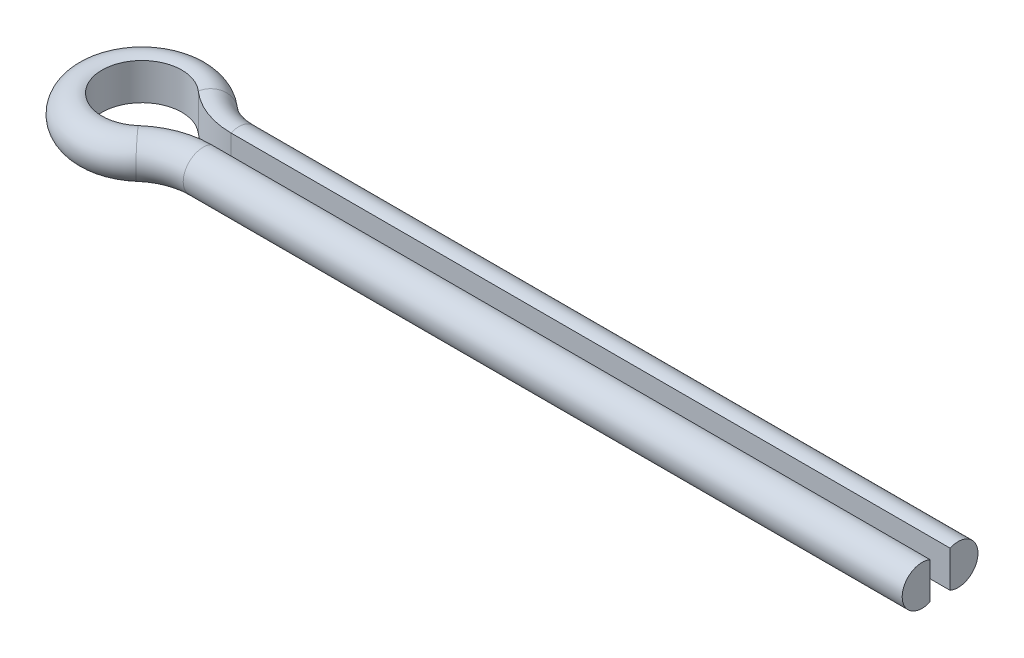
ISO-10303-21;
HEADER;
FILE_DESCRIPTION(('STEP AP214'),'2;1');
FILE_NAME('part.step','',(''),(''),'','','');
FILE_SCHEMA(('AUTOMOTIVE_DESIGN { 1 0 10303 214 1 1 1 1 }'));
ENDSEC;
DATA;
#1=APPLICATION_CONTEXT('core data for automotive mechanical design processes');
#2=APPLICATION_PROTOCOL_DEFINITION('international standard','automotive_design',2000,#1);
#3=PRODUCT_CONTEXT('',#1,'mechanical');
#4=PRODUCT('Part','Part','',(#3));
#5=PRODUCT_RELATED_PRODUCT_CATEGORY('part','',(#4));
#6=PRODUCT_DEFINITION_FORMATION('','',#4);
#7=PRODUCT_DEFINITION_CONTEXT('part definition',#1,'design');
#8=PRODUCT_DEFINITION('design','',#6,#7);
#9=PRODUCT_DEFINITION_SHAPE('','',#8);
#10=(LENGTH_UNIT() NAMED_UNIT(*) SI_UNIT(.MILLI.,.METRE.));
#11=(NAMED_UNIT(*) PLANE_ANGLE_UNIT() SI_UNIT($,.RADIAN.));
#12=(NAMED_UNIT(*) SI_UNIT($,.STERADIAN.) SOLID_ANGLE_UNIT());
#13=UNCERTAINTY_MEASURE_WITH_UNIT(LENGTH_MEASURE(1.E-05),#10,'distance_accuracy_value','');
#14=(GEOMETRIC_REPRESENTATION_CONTEXT(3) GLOBAL_UNCERTAINTY_ASSIGNED_CONTEXT((#13)) GLOBAL_UNIT_ASSIGNED_CONTEXT((#10,
#11,#12)) REPRESENTATION_CONTEXT('',''));
#15=CARTESIAN_POINT('',(0.,0.,0.));
#16=DIRECTION('',(0.,0.,1.));
#17=DIRECTION('',(1.,0.,0.));
#18=AXIS2_PLACEMENT_3D('',#15,#16,#17);
#19=CARTESIAN_POINT('',(0.,0.,1.));
#20=DIRECTION('',(-1.,0.,0.));
#21=DIRECTION('',(0.,0.,1.));
#22=AXIS2_PLACEMENT_3D('',#19,#20,#21);
#23=PLANE('',#22);
#24=CARTESIAN_POINT('',(0.,0.,1.));
#25=DIRECTION('',(1.,0.,0.));
#26=DIRECTION('',(0.,0.,1.));
#27=AXIS2_PLACEMENT_3D('',#24,#25,#26);
#28=CIRCLE('',#27,2.5);
#29=CARTESIAN_POINT('',(0.,2.29128784747792,0.));
#30=VERTEX_POINT('',#29);
#31=CARTESIAN_POINT('',(0.,-2.29128784747792,0.));
#32=VERTEX_POINT('',#31);
#33=EDGE_CURVE('E97',#30,#32,#28,.T.);
#34=ORIENTED_EDGE('',*,*,#33,.T.);
#35=DIRECTION('',(0.,1.,0.));
#36=VECTOR('',#35,1.);
#37=CARTESIAN_POINT('',(0.,-2.29128784747792,0.));
#38=LINE('',#37,#36);
#39=EDGE_CURVE('E107',#32,#30,#38,.T.);
#40=ORIENTED_EDGE('',*,*,#39,.T.);
#41=EDGE_LOOP('',(#34,#40));
#42=FACE_BOUND('',#41,.T.);
#43=ADVANCED_FACE('F45',(#42),#23,.F.);
#44=CARTESIAN_POINT('',(0.,0.,-3.49999999999999));
#45=DIRECTION('',(1.,0.,0.));
#46=DIRECTION('',(0.,0.,-1.));
#47=AXIS2_PLACEMENT_3D('',#44,#45,#46);
#48=PLANE('',#47);
#49=CARTESIAN_POINT('',(0.,0.,-3.49999999999999));
#50=DIRECTION('',(-1.,0.,0.));
#51=DIRECTION('',(0.,0.,-1.));
#52=AXIS2_PLACEMENT_3D('',#49,#50,#51);
#53=CIRCLE('',#52,2.5);
#54=CARTESIAN_POINT('',(0.,2.29128784747792,-2.49999999999999));
#55=VERTEX_POINT('',#54);
#56=CARTESIAN_POINT('',(0.,-2.29128784747792,-2.49999999999999));
#57=VERTEX_POINT('',#56);
#58=EDGE_CURVE('E60',#55,#57,#53,.T.);
#59=ORIENTED_EDGE('',*,*,#58,.F.);
#60=DIRECTION('',(0.,1.,0.));
#61=VECTOR('',#60,1.);
#62=CARTESIAN_POINT('',(0.,-2.29128784747792,-2.49999999999999));
#63=LINE('',#62,#61);
#64=EDGE_CURVE('E11',#57,#55,#63,.T.);
#65=ORIENTED_EDGE('',*,*,#64,.F.);
#66=EDGE_LOOP('',(#59,#65));
#67=FACE_BOUND('',#66,.T.);
#68=ADVANCED_FACE('F217',(#67),#48,.T.);
#69=CARTESIAN_POINT('',(0.,0.,1.));
#70=DIRECTION('',(-1.,0.,0.));
#71=DIRECTION('',(0.,0.,1.));
#72=AXIS2_PLACEMENT_3D('',#69,#70,#71);
#73=CYLINDRICAL_SURFACE('',#72,2.5);
#74=DIRECTION('',(-1.,0.,0.));
#75=VECTOR('',#74,1.);
#76=CARTESIAN_POINT('',(0.,-2.29128784747792,0.));
#77=LINE('',#76,#75);
#78=CARTESIAN_POINT('',(-90.0784325835078,-2.29128784747792,0.));
#79=VERTEX_POINT('',#78);
#80=EDGE_CURVE('E104',#32,#79,#77,.T.);
#81=ORIENTED_EDGE('',*,*,#80,.F.);
#82=ORIENTED_EDGE('',*,*,#33,.F.);
#83=DIRECTION('',(-1.,0.,0.));
#84=VECTOR('',#83,1.);
#85=CARTESIAN_POINT('',(0.,2.29128784747792,0.));
#86=LINE('',#85,#84);
#87=CARTESIAN_POINT('',(-90.0784325835078,2.29128784747792,0.));
#88=VERTEX_POINT('',#87);
#89=EDGE_CURVE('E102',#30,#88,#86,.T.);
#90=ORIENTED_EDGE('',*,*,#89,.T.);
#91=CARTESIAN_POINT('',(-90.0784325835078,0.,1.00000000000001));
#92=DIRECTION('',(1.,0.,0.));
#93=DIRECTION('',(0.,0.,1.));
#94=AXIS2_PLACEMENT_3D('',#91,#92,#93);
#95=CIRCLE('',#94,2.5);
#96=EDGE_CURVE('E118',#88,#79,#95,.T.);
#97=ORIENTED_EDGE('',*,*,#96,.T.);
#98=EDGE_LOOP('',(#81,#82,#90,#97));
#99=FACE_BOUND('',#98,.T.);
#100=ADVANCED_FACE('F99',(#99),#73,.T.);
#101=CARTESIAN_POINT('',(0.,-2.29128784747792,0.));
#102=DIRECTION('',(0.,0.,1.));
#103=DIRECTION('',(0.,-1.,0.));
#104=AXIS2_PLACEMENT_3D('',#101,#102,#103);
#105=PLANE('',#104);
#106=DIRECTION('',(0.,1.,0.));
#107=VECTOR('',#106,1.);
#108=CARTESIAN_POINT('',(-90.0784325835078,-2.29128784747792,0.));
#109=LINE('',#108,#107);
#110=EDGE_CURVE('E115',#79,#88,#109,.T.);
#111=ORIENTED_EDGE('',*,*,#110,.T.);
#112=ORIENTED_EDGE('',*,*,#89,.F.);
#113=ORIENTED_EDGE('',*,*,#39,.F.);
#114=ORIENTED_EDGE('',*,*,#80,.T.);
#115=EDGE_LOOP('',(#111,#112,#113,#114));
#116=FACE_BOUND('',#115,.T.);
#117=ADVANCED_FACE('F113',(#116),#105,.F.);
#118=CARTESIAN_POINT('',(-90.0784325835078,0.,10.));
#119=DIRECTION('',(0.,1.,0.));
#120=DIRECTION('',(0.,0.,1.));
#121=AXIS2_PLACEMENT_3D('',#118,#119,#120);
#122=TOROIDAL_SURFACE('',#121,9.,2.5);
#123=CARTESIAN_POINT('',(-90.0784325835078,-2.29128784747792,10.));
#124=DIRECTION('',(0.,1.,0.));
#125=DIRECTION('',(0.,0.,-1.));
#126=AXIS2_PLACEMENT_3D('',#123,#124,#125);
#127=CIRCLE('',#126,10.);
#128=CARTESIAN_POINT('',(-96.6928108611693,-2.29128784747792,2.50000000000001));
#129=VERTEX_POINT('',#128);
#130=EDGE_CURVE('E128',#79,#129,#127,.T.);
#131=ORIENTED_EDGE('',*,*,#130,.F.);
#132=ORIENTED_EDGE('',*,*,#96,.F.);
#133=CARTESIAN_POINT('',(-90.0784325835078,2.29128784747792,10.));
#134=DIRECTION('',(0.,1.,0.));
#135=DIRECTION('',(0.,0.,-1.));
#136=AXIS2_PLACEMENT_3D('',#133,#134,#135);
#137=CIRCLE('',#136,10.);
#138=CARTESIAN_POINT('',(-96.6928108611693,2.29128784747792,2.50000000000001));
#139=VERTEX_POINT('',#138);
#140=EDGE_CURVE('E129',#88,#139,#137,.T.);
#141=ORIENTED_EDGE('',*,*,#140,.T.);
#142=CARTESIAN_POINT('',(-96.0313730334031,0.,3.25));
#143=DIRECTION('',(0.750000000000001,0.,-0.661437827766147));
#144=DIRECTION('',(0.661437827766147,0.,0.750000000000001));
#145=AXIS2_PLACEMENT_3D('',#142,#143,#144);
#146=CIRCLE('',#145,2.5);
#147=EDGE_CURVE('E124',#139,#129,#146,.T.);
#148=ORIENTED_EDGE('',*,*,#147,.T.);
#149=EDGE_LOOP('',(#131,#132,#141,#148));
#150=FACE_BOUND('',#149,.T.);
#151=ADVANCED_FACE('F197',(#150),#122,.T.);
#152=CARTESIAN_POINT('',(-90.0784325835078,0.,10.));
#153=DIRECTION('',(0.,1.,0.));
#154=DIRECTION('',(0.,0.,1.));
#155=AXIS2_PLACEMENT_3D('',#152,#153,#154);
#156=CYLINDRICAL_SURFACE('',#155,10.);
#157=DIRECTION('',(0.,1.,0.));
#158=VECTOR('',#157,1.);
#159=CARTESIAN_POINT('',(-96.6928108611693,-2.29128784747792,2.5));
#160=LINE('',#159,#158);
#161=EDGE_CURVE('E133',#129,#139,#160,.T.);
#162=ORIENTED_EDGE('',*,*,#161,.T.);
#163=ORIENTED_EDGE('',*,*,#140,.F.);
#164=ORIENTED_EDGE('',*,*,#110,.F.);
#165=ORIENTED_EDGE('',*,*,#130,.T.);
#166=EDGE_LOOP('',(#162,#163,#164,#165));
#167=FACE_BOUND('',#166,.T.);
#168=ADVANCED_FACE('F195',(#167),#156,.T.);
#169=CARTESIAN_POINT('',(-100.,0.,-1.24999999999999));
#170=DIRECTION('',(0.,-1.,0.));
#171=DIRECTION('',(0.,0.,-1.));
#172=AXIS2_PLACEMENT_3D('',#169,#170,#171);
#173=TOROIDAL_SURFACE('',#172,6.,2.5);
#174=CARTESIAN_POINT('',(-100.,-2.29128784747792,-1.24999999999999));
#175=DIRECTION('',(0.,-1.,0.));
#176=DIRECTION('',(0.661437827766148,0.,0.75));
#177=AXIS2_PLACEMENT_3D('',#174,#175,#176);
#178=CIRCLE('',#177,5.);
#179=CARTESIAN_POINT('',(-96.6928108611693,-2.29128784747792,-4.99999999999999));
#180=VERTEX_POINT('',#179);
#181=EDGE_CURVE('E141',#129,#180,#178,.T.);
#182=ORIENTED_EDGE('',*,*,#181,.F.);
#183=ORIENTED_EDGE('',*,*,#147,.F.);
#184=CARTESIAN_POINT('',(-100.,2.29128784747792,-1.24999999999999));
#185=DIRECTION('',(0.,-1.,0.));
#186=DIRECTION('',(0.661437827766148,0.,0.75));
#187=AXIS2_PLACEMENT_3D('',#184,#185,#186);
#188=CIRCLE('',#187,5.);
#189=CARTESIAN_POINT('',(-96.6928108611693,2.29128784747792,-4.99999999999999));
#190=VERTEX_POINT('',#189);
#191=EDGE_CURVE('E142',#139,#190,#188,.T.);
#192=ORIENTED_EDGE('',*,*,#191,.T.);
#193=CARTESIAN_POINT('',(-96.0313730334031,0.,-5.74999999999999));
#194=DIRECTION('',(-0.75,0.,-0.661437827766148));
#195=DIRECTION('',(0.661437827766148,0.,-0.75));
#196=AXIS2_PLACEMENT_3D('',#193,#194,#195);
#197=CIRCLE('',#196,2.5);
#198=EDGE_CURVE('E137',#190,#180,#197,.T.);
#199=ORIENTED_EDGE('',*,*,#198,.T.);
#200=EDGE_LOOP('',(#182,#183,#192,#199));
#201=FACE_BOUND('',#200,.T.);
#202=ADVANCED_FACE('F190',(#201),#173,.T.);
#203=CARTESIAN_POINT('',(-100.,0.,-1.24999999999999));
#204=DIRECTION('',(0.,-1.,0.));
#205=DIRECTION('',(0.,0.,-1.));
#206=AXIS2_PLACEMENT_3D('',#203,#204,#205);
#207=CYLINDRICAL_SURFACE('',#206,5.);
#208=DIRECTION('',(0.,1.,0.));
#209=VECTOR('',#208,1.);
#210=CARTESIAN_POINT('',(-96.6928108611693,-2.29128784747792,-4.99999999999999));
#211=LINE('',#210,#209);
#212=EDGE_CURVE('E146',#180,#190,#211,.T.);
#213=ORIENTED_EDGE('',*,*,#212,.T.);
#214=ORIENTED_EDGE('',*,*,#191,.F.);
#215=ORIENTED_EDGE('',*,*,#161,.F.);
#216=ORIENTED_EDGE('',*,*,#181,.T.);
#217=EDGE_LOOP('',(#213,#214,#215,#216));
#218=FACE_BOUND('',#217,.T.);
#219=ADVANCED_FACE('F193',(#218),#207,.F.);
#220=CARTESIAN_POINT('',(-90.0784325835078,0.,-12.5));
#221=DIRECTION('',(0.,1.,0.));
#222=DIRECTION('',(0.,0.,1.));
#223=AXIS2_PLACEMENT_3D('',#220,#221,#222);
#224=TOROIDAL_SURFACE('',#223,8.99999999999999,2.5);
#225=CARTESIAN_POINT('',(-90.0784325835078,-2.29128784747792,-12.5));
#226=DIRECTION('',(0.,1.,0.));
#227=DIRECTION('',(-0.661437827766147,0.,0.750000000000001));
#228=AXIS2_PLACEMENT_3D('',#225,#226,#227);
#229=CIRCLE('',#228,9.99999999999999);
#230=CARTESIAN_POINT('',(-90.0784325835078,-2.29128784747792,-2.49999999999999));
#231=VERTEX_POINT('',#230);
#232=EDGE_CURVE('E154',#180,#231,#229,.T.);
#233=ORIENTED_EDGE('',*,*,#232,.F.);
#234=ORIENTED_EDGE('',*,*,#198,.F.);
#235=CARTESIAN_POINT('',(-90.0784325835078,2.29128784747792,-12.5));
#236=DIRECTION('',(0.,1.,0.));
#237=DIRECTION('',(-0.661437827766147,0.,0.75));
#238=AXIS2_PLACEMENT_3D('',#235,#236,#237);
#239=CIRCLE('',#238,9.99999999999999);
#240=CARTESIAN_POINT('',(-90.0784325835078,2.29128784747792,-2.49999999999999));
#241=VERTEX_POINT('',#240);
#242=EDGE_CURVE('E155',#190,#241,#239,.T.);
#243=ORIENTED_EDGE('',*,*,#242,.T.);
#244=CARTESIAN_POINT('',(-90.0784325835078,0.,-3.49999999999999));
#245=DIRECTION('',(-1.,0.,0.));
#246=DIRECTION('',(0.,0.,-1.));
#247=AXIS2_PLACEMENT_3D('',#244,#245,#246);
#248=CIRCLE('',#247,2.5);
#249=EDGE_CURVE('E150',#241,#231,#248,.T.);
#250=ORIENTED_EDGE('',*,*,#249,.T.);
#251=EDGE_LOOP('',(#233,#234,#243,#250));
#252=FACE_BOUND('',#251,.T.);
#253=ADVANCED_FACE('F187',(#252),#224,.T.);
#254=CARTESIAN_POINT('',(-90.0784325835078,0.,-12.5));
#255=DIRECTION('',(0.,1.,0.));
#256=DIRECTION('',(0.,0.,1.));
#257=AXIS2_PLACEMENT_3D('',#254,#255,#256);
#258=CYLINDRICAL_SURFACE('',#257,9.99999999999999);
#259=DIRECTION('',(0.,1.,0.));
#260=VECTOR('',#259,1.);
#261=CARTESIAN_POINT('',(-90.0784325835078,-2.29128784747792,-2.49999999999999));
#262=LINE('',#261,#260);
#263=EDGE_CURVE('E159',#231,#241,#262,.T.);
#264=ORIENTED_EDGE('',*,*,#263,.T.);
#265=ORIENTED_EDGE('',*,*,#242,.F.);
#266=ORIENTED_EDGE('',*,*,#212,.F.);
#267=ORIENTED_EDGE('',*,*,#232,.T.);
#268=EDGE_LOOP('',(#264,#265,#266,#267));
#269=FACE_BOUND('',#268,.T.);
#270=ADVANCED_FACE('F182',(#269),#258,.T.);
#271=CARTESIAN_POINT('',(-90.0784325835078,0.,-3.49999999999999));
#272=DIRECTION('',(1.,0.,0.));
#273=DIRECTION('',(0.,0.,-1.));
#274=AXIS2_PLACEMENT_3D('',#271,#272,#273);
#275=CYLINDRICAL_SURFACE('',#274,2.5);
#276=DIRECTION('',(1.,0.,0.));
#277=VECTOR('',#276,1.);
#278=CARTESIAN_POINT('',(-90.0784325835078,-2.29128784747792,-2.49999999999999));
#279=LINE('',#278,#277);
#280=EDGE_CURVE('E53',#231,#57,#279,.T.);
#281=ORIENTED_EDGE('',*,*,#280,.F.);
#282=ORIENTED_EDGE('',*,*,#249,.F.);
#283=DIRECTION('',(1.,0.,0.));
#284=VECTOR('',#283,1.);
#285=CARTESIAN_POINT('',(-90.0784325835078,2.29128784747792,-2.49999999999999));
#286=LINE('',#285,#284);
#287=EDGE_CURVE('E165',#241,#55,#286,.T.);
#288=ORIENTED_EDGE('',*,*,#287,.T.);
#289=ORIENTED_EDGE('',*,*,#58,.T.);
#290=EDGE_LOOP('',(#281,#282,#288,#289));
#291=FACE_BOUND('',#290,.T.);
#292=ADVANCED_FACE('F184',(#291),#275,.T.);
#293=CARTESIAN_POINT('',(-90.0784325835078,-2.29128784747792,-2.49999999999999));
#294=DIRECTION('',(0.,0.,-1.));
#295=DIRECTION('',(0.,1.,0.));
#296=AXIS2_PLACEMENT_3D('',#293,#294,#295);
#297=PLANE('',#296);
#298=ORIENTED_EDGE('',*,*,#64,.T.);
#299=ORIENTED_EDGE('',*,*,#287,.F.);
#300=ORIENTED_EDGE('',*,*,#263,.F.);
#301=ORIENTED_EDGE('',*,*,#280,.T.);
#302=EDGE_LOOP('',(#298,#299,#300,#301));
#303=FACE_BOUND('',#302,.T.);
#304=ADVANCED_FACE('F208',(#303),#297,.F.);
#305=CLOSED_SHELL('',(#43,#68,#100,#117,#151,#168,#202,#219,#253,#270,#292,#304));
#306=MANIFOLD_SOLID_BREP('B2',#305);
#307=ADVANCED_BREP_SHAPE_REPRESENTATION('',(#18,#306),#14);
#308=SHAPE_DEFINITION_REPRESENTATION(#9,#307);
ENDSEC;
END-ISO-10303-21;
